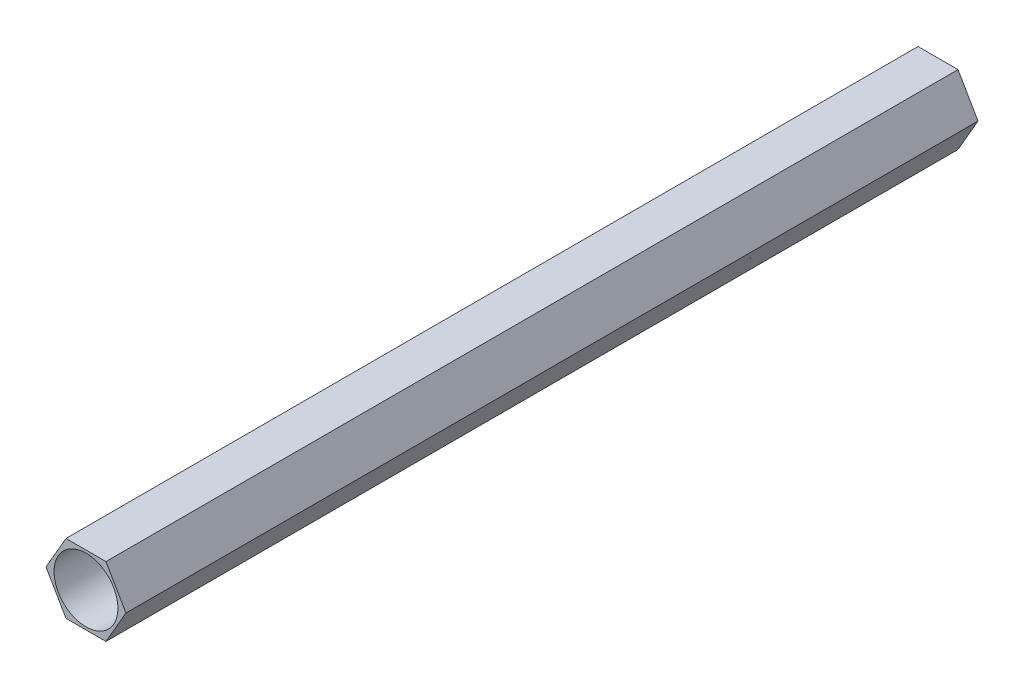
ISO-10303-21;
HEADER;
FILE_DESCRIPTION(('STEP AP214'),'2;1');
FILE_NAME('part.step','',(''),(''),'','','');
FILE_SCHEMA(('AUTOMOTIVE_DESIGN { 1 0 10303 214 1 1 1 1 }'));
ENDSEC;
DATA;
#1=APPLICATION_CONTEXT('core data for automotive mechanical design processes');
#2=APPLICATION_PROTOCOL_DEFINITION('international standard','automotive_design',2000,#1);
#3=PRODUCT_CONTEXT('',#1,'mechanical');
#4=PRODUCT('Part','Part','',(#3));
#5=PRODUCT_RELATED_PRODUCT_CATEGORY('part','',(#4));
#6=PRODUCT_DEFINITION_FORMATION('','',#4);
#7=PRODUCT_DEFINITION_CONTEXT('part definition',#1,'design');
#8=PRODUCT_DEFINITION('design','',#6,#7);
#9=PRODUCT_DEFINITION_SHAPE('','',#8);
#10=(LENGTH_UNIT() NAMED_UNIT(*) SI_UNIT(.MILLI.,.METRE.));
#11=(NAMED_UNIT(*) PLANE_ANGLE_UNIT() SI_UNIT($,.RADIAN.));
#12=(NAMED_UNIT(*) SI_UNIT($,.STERADIAN.) SOLID_ANGLE_UNIT());
#13=UNCERTAINTY_MEASURE_WITH_UNIT(LENGTH_MEASURE(1.E-05),#10,'distance_accuracy_value','');
#14=(GEOMETRIC_REPRESENTATION_CONTEXT(3) GLOBAL_UNCERTAINTY_ASSIGNED_CONTEXT((#13)) GLOBAL_UNIT_ASSIGNED_CONTEXT((#10,
#11,#12)) REPRESENTATION_CONTEXT('',''));
#15=CARTESIAN_POINT('',(0.,0.,0.));
#16=DIRECTION('',(0.,0.,1.));
#17=DIRECTION('',(1.,0.,0.));
#18=AXIS2_PLACEMENT_3D('',#15,#16,#17);
#19=CARTESIAN_POINT('',(0.938194187433142,-1.625,40.));
#20=DIRECTION('',(-0.866025403784439,0.5,0.));
#21=DIRECTION('',(-0.5,-0.866025403784439,0.));
#22=AXIS2_PLACEMENT_3D('',#19,#20,#21);
#23=PLANE('',#22);
#24=DIRECTION('',(0.499999999999999,0.866025403784439,0.));
#25=VECTOR('',#24,1.);
#26=CARTESIAN_POINT('',(0.938194187433142,-1.625,0.));
#27=LINE('',#26,#25);
#28=CARTESIAN_POINT('',(0.938194187433142,-1.625,0.));
#29=VERTEX_POINT('',#28);
#30=CARTESIAN_POINT('',(1.87638837486628,0.,0.));
#31=VERTEX_POINT('',#30);
#32=EDGE_CURVE('E117',#29,#31,#27,.T.);
#33=ORIENTED_EDGE('',*,*,#32,.T.);
#34=DIRECTION('',(0.,0.,-1.));
#35=VECTOR('',#34,1.);
#36=CARTESIAN_POINT('',(1.87638837486628,0.,40.));
#37=LINE('',#36,#35);
#38=CARTESIAN_POINT('',(1.87638837486628,0.,40.));
#39=VERTEX_POINT('',#38);
#40=EDGE_CURVE('E11',#39,#31,#37,.T.);
#41=ORIENTED_EDGE('',*,*,#40,.F.);
#42=DIRECTION('',(0.499999999999999,0.866025403784439,0.));
#43=VECTOR('',#42,1.);
#44=CARTESIAN_POINT('',(0.938194187433142,-1.625,40.));
#45=LINE('',#44,#43);
#46=CARTESIAN_POINT('',(0.938194187433142,-1.625,40.));
#47=VERTEX_POINT('',#46);
#48=EDGE_CURVE('E128',#47,#39,#45,.T.);
#49=ORIENTED_EDGE('',*,*,#48,.F.);
#50=DIRECTION('',(0.,0.,-1.));
#51=VECTOR('',#50,1.);
#52=CARTESIAN_POINT('',(0.938194187433142,-1.625,40.));
#53=LINE('',#52,#51);
#54=EDGE_CURVE('E113',#47,#29,#53,.T.);
#55=ORIENTED_EDGE('',*,*,#54,.T.);
#56=EDGE_LOOP('',(#33,#41,#49,#55));
#57=FACE_BOUND('',#56,.T.);
#58=ADVANCED_FACE('F33',(#57),#23,.F.);
#59=CARTESIAN_POINT('',(1.87638837486628,0.,40.));
#60=DIRECTION('',(-0.866025403784439,-0.5,0.));
#61=DIRECTION('',(0.5,-0.866025403784439,0.));
#62=AXIS2_PLACEMENT_3D('',#59,#60,#61);
#63=PLANE('',#62);
#64=DIRECTION('',(-0.5,0.866025403784439,0.));
#65=VECTOR('',#64,1.);
#66=CARTESIAN_POINT('',(1.87638837486628,0.,0.));
#67=LINE('',#66,#65);
#68=CARTESIAN_POINT('',(0.938194187433141,1.625,0.));
#69=VERTEX_POINT('',#68);
#70=EDGE_CURVE('E120',#31,#69,#67,.T.);
#71=ORIENTED_EDGE('',*,*,#70,.T.);
#72=DIRECTION('',(0.,0.,-1.));
#73=VECTOR('',#72,1.);
#74=CARTESIAN_POINT('',(0.938194187433141,1.625,40.));
#75=LINE('',#74,#73);
#76=CARTESIAN_POINT('',(0.938194187433141,1.625,40.));
#77=VERTEX_POINT('',#76);
#78=EDGE_CURVE('E41',#77,#69,#75,.T.);
#79=ORIENTED_EDGE('',*,*,#78,.F.);
#80=DIRECTION('',(-0.5,0.866025403784439,0.));
#81=VECTOR('',#80,1.);
#82=CARTESIAN_POINT('',(1.87638837486628,0.,40.));
#83=LINE('',#82,#81);
#84=EDGE_CURVE('E86',#39,#77,#83,.T.);
#85=ORIENTED_EDGE('',*,*,#84,.F.);
#86=ORIENTED_EDGE('',*,*,#40,.T.);
#87=EDGE_LOOP('',(#71,#79,#85,#86));
#88=FACE_BOUND('',#87,.T.);
#89=ADVANCED_FACE('F153',(#88),#63,.F.);
#90=CARTESIAN_POINT('',(0.938194187433141,1.625,40.));
#91=DIRECTION('',(0.,-1.,0.));
#92=DIRECTION('',(1.,0.,0.));
#93=AXIS2_PLACEMENT_3D('',#90,#91,#92);
#94=PLANE('',#93);
#95=DIRECTION('',(-1.,0.,0.));
#96=VECTOR('',#95,1.);
#97=CARTESIAN_POINT('',(0.938194187433141,1.625,0.));
#98=LINE('',#97,#96);
#99=CARTESIAN_POINT('',(-0.938194187433143,1.625,0.));
#100=VERTEX_POINT('',#99);
#101=EDGE_CURVE('E123',#69,#100,#98,.T.);
#102=ORIENTED_EDGE('',*,*,#101,.T.);
#103=DIRECTION('',(0.,0.,-1.));
#104=VECTOR('',#103,1.);
#105=CARTESIAN_POINT('',(-0.938194187433143,1.625,40.));
#106=LINE('',#105,#104);
#107=CARTESIAN_POINT('',(-0.938194187433143,1.625,40.));
#108=VERTEX_POINT('',#107);
#109=EDGE_CURVE('E108',#108,#100,#106,.T.);
#110=ORIENTED_EDGE('',*,*,#109,.F.);
#111=DIRECTION('',(-1.,0.,0.));
#112=VECTOR('',#111,1.);
#113=CARTESIAN_POINT('',(0.938194187433141,1.625,40.));
#114=LINE('',#113,#112);
#115=EDGE_CURVE('E99',#77,#108,#114,.T.);
#116=ORIENTED_EDGE('',*,*,#115,.F.);
#117=ORIENTED_EDGE('',*,*,#78,.T.);
#118=EDGE_LOOP('',(#102,#110,#116,#117));
#119=FACE_BOUND('',#118,.T.);
#120=ADVANCED_FACE('F134',(#119),#94,.F.);
#121=CARTESIAN_POINT('',(-0.938194187433143,1.625,40.));
#122=DIRECTION('',(0.866025403784439,-0.5,0.));
#123=DIRECTION('',(0.5,0.866025403784439,0.));
#124=AXIS2_PLACEMENT_3D('',#121,#122,#123);
#125=PLANE('',#124);
#126=DIRECTION('',(-0.5,-0.866025403784439,0.));
#127=VECTOR('',#126,1.);
#128=CARTESIAN_POINT('',(-0.938194187433143,1.625,0.));
#129=LINE('',#128,#127);
#130=CARTESIAN_POINT('',(-1.87638837486628,0.,0.));
#131=VERTEX_POINT('',#130);
#132=EDGE_CURVE('E107',#100,#131,#129,.T.);
#133=ORIENTED_EDGE('',*,*,#132,.T.);
#134=DIRECTION('',(0.,0.,-1.));
#135=VECTOR('',#134,1.);
#136=CARTESIAN_POINT('',(-1.87638837486628,0.,40.));
#137=LINE('',#136,#135);
#138=CARTESIAN_POINT('',(-1.87638837486628,0.,40.));
#139=VERTEX_POINT('',#138);
#140=EDGE_CURVE('E104',#139,#131,#137,.T.);
#141=ORIENTED_EDGE('',*,*,#140,.F.);
#142=DIRECTION('',(-0.5,-0.866025403784439,0.));
#143=VECTOR('',#142,1.);
#144=CARTESIAN_POINT('',(-0.938194187433143,1.625,40.));
#145=LINE('',#144,#143);
#146=EDGE_CURVE('E93',#108,#139,#145,.T.);
#147=ORIENTED_EDGE('',*,*,#146,.F.);
#148=ORIENTED_EDGE('',*,*,#109,.T.);
#149=EDGE_LOOP('',(#133,#141,#147,#148));
#150=FACE_BOUND('',#149,.T.);
#151=ADVANCED_FACE('F105',(#150),#125,.F.);
#152=CARTESIAN_POINT('',(-1.87638837486628,0.,40.));
#153=DIRECTION('',(0.866025403784439,0.5,0.));
#154=DIRECTION('',(-0.5,0.866025403784439,0.));
#155=AXIS2_PLACEMENT_3D('',#152,#153,#154);
#156=PLANE('',#155);
#157=DIRECTION('',(0.5,-0.866025403784439,0.));
#158=VECTOR('',#157,1.);
#159=CARTESIAN_POINT('',(-1.87638837486628,0.,0.));
#160=LINE('',#159,#158);
#161=CARTESIAN_POINT('',(-0.938194187433142,-1.625,0.));
#162=VERTEX_POINT('',#161);
#163=EDGE_CURVE('E72',#131,#162,#160,.T.);
#164=ORIENTED_EDGE('',*,*,#163,.T.);
#165=DIRECTION('',(0.,0.,-1.));
#166=VECTOR('',#165,1.);
#167=CARTESIAN_POINT('',(-0.938194187433142,-1.625,40.));
#168=LINE('',#167,#166);
#169=CARTESIAN_POINT('',(-0.938194187433142,-1.625,40.));
#170=VERTEX_POINT('',#169);
#171=EDGE_CURVE('E109',#170,#162,#168,.T.);
#172=ORIENTED_EDGE('',*,*,#171,.F.);
#173=DIRECTION('',(0.5,-0.866025403784439,0.));
#174=VECTOR('',#173,1.);
#175=CARTESIAN_POINT('',(-1.87638837486628,0.,40.));
#176=LINE('',#175,#174);
#177=EDGE_CURVE('E97',#139,#170,#176,.T.);
#178=ORIENTED_EDGE('',*,*,#177,.F.);
#179=ORIENTED_EDGE('',*,*,#140,.T.);
#180=EDGE_LOOP('',(#164,#172,#178,#179));
#181=FACE_BOUND('',#180,.T.);
#182=ADVANCED_FACE('F111',(#181),#156,.F.);
#183=CARTESIAN_POINT('',(-0.938194187433142,-1.625,40.));
#184=DIRECTION('',(0.,1.,0.));
#185=DIRECTION('',(-1.,0.,0.));
#186=AXIS2_PLACEMENT_3D('',#183,#184,#185);
#187=PLANE('',#186);
#188=DIRECTION('',(1.,0.,0.));
#189=VECTOR('',#188,1.);
#190=CARTESIAN_POINT('',(-0.938194187433142,-1.625,0.));
#191=LINE('',#190,#189);
#192=EDGE_CURVE('E78',#162,#29,#191,.T.);
#193=ORIENTED_EDGE('',*,*,#192,.T.);
#194=ORIENTED_EDGE('',*,*,#54,.F.);
#195=DIRECTION('',(1.,0.,0.));
#196=VECTOR('',#195,1.);
#197=CARTESIAN_POINT('',(-0.938194187433142,-1.625,40.));
#198=LINE('',#197,#196);
#199=EDGE_CURVE('E49',#170,#47,#198,.T.);
#200=ORIENTED_EDGE('',*,*,#199,.F.);
#201=ORIENTED_EDGE('',*,*,#171,.T.);
#202=EDGE_LOOP('',(#193,#194,#200,#201));
#203=FACE_BOUND('',#202,.T.);
#204=ADVANCED_FACE('F141',(#203),#187,.F.);
#205=CARTESIAN_POINT('',(0.,0.,40.));
#206=DIRECTION('',(0.,0.,1.));
#207=DIRECTION('',(1.,0.,0.));
#208=AXIS2_PLACEMENT_3D('',#205,#206,#207);
#209=PLANE('',#208);
#210=CARTESIAN_POINT('',(0.,0.,40.));
#211=DIRECTION('',(0.,0.,1.));
#212=DIRECTION('',(1.,0.,0.));
#213=AXIS2_PLACEMENT_3D('',#210,#211,#212);
#214=CIRCLE('',#213,1.5);
#215=CARTESIAN_POINT('',(1.5,0.,40.));
#216=VERTEX_POINT('',#215);
#217=EDGE_CURVE('E121',#216,#216,#214,.T.);
#218=ORIENTED_EDGE('',*,*,#217,.F.);
#219=EDGE_LOOP('',(#218));
#220=FACE_BOUND('',#219,.T.);
#221=ORIENTED_EDGE('',*,*,#48,.T.);
#222=ORIENTED_EDGE('',*,*,#84,.T.);
#223=ORIENTED_EDGE('',*,*,#115,.T.);
#224=ORIENTED_EDGE('',*,*,#146,.T.);
#225=ORIENTED_EDGE('',*,*,#177,.T.);
#226=ORIENTED_EDGE('',*,*,#199,.T.);
#227=EDGE_LOOP('',(#221,#222,#223,#224,#225,#226));
#228=FACE_BOUND('',#227,.T.);
#229=ADVANCED_FACE('F95',(#220,#228),#209,.T.);
#230=CARTESIAN_POINT('',(0.,0.,0.));
#231=DIRECTION('',(0.,0.,1.));
#232=DIRECTION('',(1.,0.,0.));
#233=AXIS2_PLACEMENT_3D('',#230,#231,#232);
#234=PLANE('',#233);
#235=CARTESIAN_POINT('',(0.,0.,0.));
#236=DIRECTION('',(0.,0.,-1.));
#237=DIRECTION('',(-1.,0.,0.));
#238=AXIS2_PLACEMENT_3D('',#235,#236,#237);
#239=CIRCLE('',#238,1.5);
#240=CARTESIAN_POINT('',(-1.5,0.,0.));
#241=VERTEX_POINT('',#240);
#242=EDGE_CURVE('E209',#241,#241,#239,.T.);
#243=ORIENTED_EDGE('',*,*,#242,.F.);
#244=EDGE_LOOP('',(#243));
#245=FACE_BOUND('',#244,.T.);
#246=ORIENTED_EDGE('',*,*,#32,.F.);
#247=ORIENTED_EDGE('',*,*,#192,.F.);
#248=ORIENTED_EDGE('',*,*,#163,.F.);
#249=ORIENTED_EDGE('',*,*,#132,.F.);
#250=ORIENTED_EDGE('',*,*,#101,.F.);
#251=ORIENTED_EDGE('',*,*,#70,.F.);
#252=EDGE_LOOP('',(#246,#247,#248,#249,#250,#251));
#253=FACE_BOUND('',#252,.T.);
#254=ADVANCED_FACE('F137',(#245,#253),#234,.F.);
#255=CARTESIAN_POINT('',(0.,0.,15.));
#256=DIRECTION('',(0.,0.,1.));
#257=DIRECTION('',(1.,0.,0.));
#258=AXIS2_PLACEMENT_3D('',#255,#256,#257);
#259=CYLINDRICAL_SURFACE('',#258,1.5);
#260=ORIENTED_EDGE('',*,*,#242,.T.);
#261=EDGE_LOOP('',(#260));
#262=FACE_BOUND('',#261,.T.);
#263=ORIENTED_EDGE('',*,*,#217,.T.);
#264=EDGE_LOOP('',(#263));
#265=FACE_BOUND('',#264,.T.);
#266=ADVANCED_FACE('F190',(#262,#265),#259,.F.);
#267=CLOSED_SHELL('',(#58,#89,#120,#151,#182,#204,#229,#254,#266));
#268=MANIFOLD_SOLID_BREP('B2',#267);
#269=ADVANCED_BREP_SHAPE_REPRESENTATION('',(#18,#268),#14);
#270=SHAPE_DEFINITION_REPRESENTATION(#9,#269);
ENDSEC;
END-ISO-10303-21;
